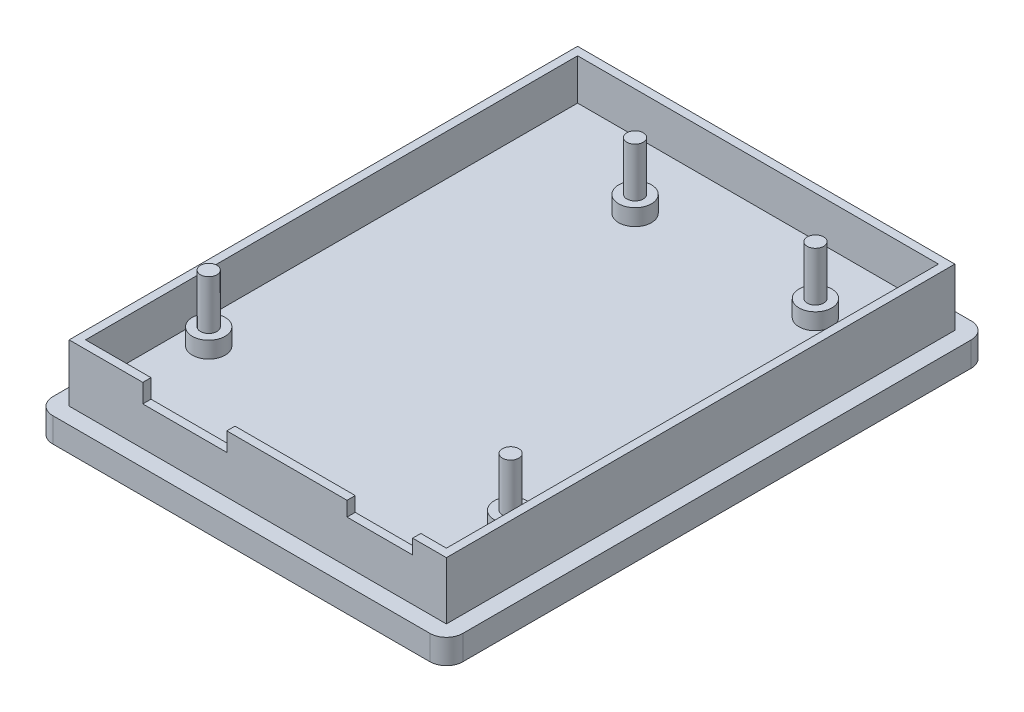
ISO-10303-21;
HEADER;
FILE_DESCRIPTION(('STEP AP214'),'2;1');
FILE_NAME('part.step','',(''),(''),'','','');
FILE_SCHEMA(('AUTOMOTIVE_DESIGN { 1 0 10303 214 1 1 1 1 }'));
ENDSEC;
DATA;
#1=APPLICATION_CONTEXT('core data for automotive mechanical design processes');
#2=APPLICATION_PROTOCOL_DEFINITION('international standard','automotive_design',2000,#1);
#3=PRODUCT_CONTEXT('',#1,'mechanical');
#4=PRODUCT('Part','Part','',(#3));
#5=PRODUCT_RELATED_PRODUCT_CATEGORY('part','',(#4));
#6=PRODUCT_DEFINITION_FORMATION('','',#4);
#7=PRODUCT_DEFINITION_CONTEXT('part definition',#1,'design');
#8=PRODUCT_DEFINITION('design','',#6,#7);
#9=PRODUCT_DEFINITION_SHAPE('','',#8);
#10=(LENGTH_UNIT() NAMED_UNIT(*) SI_UNIT(.MILLI.,.METRE.));
#11=(NAMED_UNIT(*) PLANE_ANGLE_UNIT() SI_UNIT($,.RADIAN.));
#12=(NAMED_UNIT(*) SI_UNIT($,.STERADIAN.) SOLID_ANGLE_UNIT());
#13=UNCERTAINTY_MEASURE_WITH_UNIT(LENGTH_MEASURE(1.E-05),#10,'distance_accuracy_value','');
#14=(GEOMETRIC_REPRESENTATION_CONTEXT(3) GLOBAL_UNCERTAINTY_ASSIGNED_CONTEXT((#13)) GLOBAL_UNIT_ASSIGNED_CONTEXT((#10,
#11,#12)) REPRESENTATION_CONTEXT('',''));
#15=CARTESIAN_POINT('',(0.,0.,0.));
#16=DIRECTION('',(0.,0.,1.));
#17=DIRECTION('',(1.,0.,0.));
#18=AXIS2_PLACEMENT_3D('',#15,#16,#17);
#19=CARTESIAN_POINT('',(0.,12.7,0.));
#20=DIRECTION('',(0.,1.,0.));
#21=DIRECTION('',(0.,0.,1.));
#22=AXIS2_PLACEMENT_3D('',#19,#20,#21);
#23=PLANE('',#22);
#24=DIRECTION('',(0.,0.,-1.));
#25=VECTOR('',#24,1.);
#26=CARTESIAN_POINT('',(23.9812151217302,12.7,0.));
#27=LINE('',#26,#25);
#28=CARTESIAN_POINT('',(23.9812151217302,12.7,39.37));
#29=VERTEX_POINT('',#28);
#30=CARTESIAN_POINT('',(23.9812151217302,12.7,38.1));
#31=VERTEX_POINT('',#30);
#32=EDGE_CURVE('E232',#29,#31,#27,.T.);
#33=ORIENTED_EDGE('',*,*,#32,.F.);
#34=DIRECTION('',(1.,0.,0.));
#35=VECTOR('',#34,1.);
#36=CARTESIAN_POINT('',(29.21,12.7,39.37));
#37=LINE('',#36,#35);
#38=CARTESIAN_POINT('',(29.21,12.7,39.37));
#39=VERTEX_POINT('',#38);
#40=EDGE_CURVE('E296',#29,#39,#37,.T.);
#41=ORIENTED_EDGE('',*,*,#40,.T.);
#42=DIRECTION('',(0.,0.,-1.));
#43=VECTOR('',#42,1.);
#44=CARTESIAN_POINT('',(29.21,12.7,39.37));
#45=LINE('',#44,#43);
#46=CARTESIAN_POINT('',(29.21,12.7,-39.37));
#47=VERTEX_POINT('',#46);
#48=EDGE_CURVE('E314',#39,#47,#45,.T.);
#49=ORIENTED_EDGE('',*,*,#48,.T.);
#50=DIRECTION('',(-1.,0.,0.));
#51=VECTOR('',#50,1.);
#52=CARTESIAN_POINT('',(29.21,12.7,-39.37));
#53=LINE('',#52,#51);
#54=CARTESIAN_POINT('',(-29.21,12.7,-39.37));
#55=VERTEX_POINT('',#54);
#56=EDGE_CURVE('E318',#47,#55,#53,.T.);
#57=ORIENTED_EDGE('',*,*,#56,.T.);
#58=DIRECTION('',(0.,0.,1.));
#59=VECTOR('',#58,1.);
#60=CARTESIAN_POINT('',(-29.21,12.7,39.37));
#61=LINE('',#60,#59);
#62=CARTESIAN_POINT('',(-29.21,12.7,39.37));
#63=VERTEX_POINT('',#62);
#64=EDGE_CURVE('E301',#55,#63,#61,.T.);
#65=ORIENTED_EDGE('',*,*,#64,.T.);
#66=CARTESIAN_POINT('',(-17.8088084611332,12.7,39.37));
#67=VERTEX_POINT('',#66);
#68=EDGE_CURVE('E311',#63,#67,#37,.T.);
#69=ORIENTED_EDGE('',*,*,#68,.T.);
#70=DIRECTION('',(0.,0.,1.));
#71=VECTOR('',#70,1.);
#72=CARTESIAN_POINT('',(-17.8088084611332,12.7,0.));
#73=LINE('',#72,#71);
#74=CARTESIAN_POINT('',(-17.8088084611332,12.7,38.1));
#75=VERTEX_POINT('',#74);
#76=EDGE_CURVE('E254',#75,#67,#73,.T.);
#77=ORIENTED_EDGE('',*,*,#76,.F.);
#78=DIRECTION('',(1.,0.,0.));
#79=VECTOR('',#78,1.);
#80=CARTESIAN_POINT('',(27.94,12.7,38.1));
#81=LINE('',#80,#79);
#82=CARTESIAN_POINT('',(-27.94,12.7,38.1));
#83=VERTEX_POINT('',#82);
#84=EDGE_CURVE('E359',#83,#75,#81,.T.);
#85=ORIENTED_EDGE('',*,*,#84,.F.);
#86=DIRECTION('',(0.,0.,1.));
#87=VECTOR('',#86,1.);
#88=CARTESIAN_POINT('',(-27.94,12.7,38.1));
#89=LINE('',#88,#87);
#90=CARTESIAN_POINT('',(-27.94,12.7,-38.1));
#91=VERTEX_POINT('',#90);
#92=EDGE_CURVE('E342',#91,#83,#89,.T.);
#93=ORIENTED_EDGE('',*,*,#92,.F.);
#94=DIRECTION('',(-1.,0.,0.));
#95=VECTOR('',#94,1.);
#96=CARTESIAN_POINT('',(27.94,12.7,-38.1));
#97=LINE('',#96,#95);
#98=CARTESIAN_POINT('',(27.94,12.7,-38.1));
#99=VERTEX_POINT('',#98);
#100=EDGE_CURVE('E347',#99,#91,#97,.T.);
#101=ORIENTED_EDGE('',*,*,#100,.F.);
#102=DIRECTION('',(0.,0.,-1.));
#103=VECTOR('',#102,1.);
#104=CARTESIAN_POINT('',(27.94,12.7,38.1));
#105=LINE('',#104,#103);
#106=CARTESIAN_POINT('',(27.94,12.7,38.1));
#107=VERTEX_POINT('',#106);
#108=EDGE_CURVE('E362',#107,#99,#105,.T.);
#109=ORIENTED_EDGE('',*,*,#108,.F.);
#110=EDGE_CURVE('E358',#31,#107,#81,.T.);
#111=ORIENTED_EDGE('',*,*,#110,.F.);
#112=EDGE_LOOP('',(#33,#41,#49,#57,#65,#69,#77,#85,#93,#101,#109,#111));
#113=FACE_BOUND('',#112,.T.);
#114=ADVANCED_FACE('F32',(#113),#23,.T.);
#115=CARTESIAN_POINT('',(0.,6.35,0.));
#116=DIRECTION('',(0.,1.,0.));
#117=DIRECTION('',(0.,0.,1.));
#118=AXIS2_PLACEMENT_3D('',#115,#116,#117);
#119=PLANE('',#118);
#120=CARTESIAN_POINT('',(-23.9589209865019,6.35,23.0084652209537));
#121=DIRECTION('',(0.,1.,0.));
#122=DIRECTION('',(0.,0.,1.));
#123=AXIS2_PLACEMENT_3D('',#120,#121,#122);
#124=CIRCLE('',#123,2.54);
#125=CARTESIAN_POINT('',(-23.9589209865019,6.35,25.5484652209538));
#126=VERTEX_POINT('',#125);
#127=EDGE_CURVE('E267',#126,#126,#124,.T.);
#128=ORIENTED_EDGE('',*,*,#127,.F.);
#129=EDGE_LOOP('',(#128));
#130=FACE_BOUND('',#129,.T.);
#131=CARTESIAN_POINT('',(19.208379013498,6.35,-27.7788347790462));
#132=DIRECTION('',(0.,1.,0.));
#133=DIRECTION('',(0.,0.,1.));
#134=AXIS2_PLACEMENT_3D('',#131,#132,#133);
#135=CIRCLE('',#134,2.54);
#136=CARTESIAN_POINT('',(19.208379013498,6.35,-25.2388347790462));
#137=VERTEX_POINT('',#136);
#138=EDGE_CURVE('E281',#137,#137,#135,.T.);
#139=ORIENTED_EDGE('',*,*,#138,.F.);
#140=EDGE_LOOP('',(#139));
#141=FACE_BOUND('',#140,.T.);
#142=DIRECTION('',(0.,0.,1.));
#143=VECTOR('',#142,1.);
#144=CARTESIAN_POINT('',(-27.94,6.35,38.1));
#145=LINE('',#144,#143);
#146=CARTESIAN_POINT('',(-27.94,6.35,-38.1));
#147=VERTEX_POINT('',#146);
#148=CARTESIAN_POINT('',(-27.94,6.35,38.1));
#149=VERTEX_POINT('',#148);
#150=EDGE_CURVE('E343',#147,#149,#145,.T.);
#151=ORIENTED_EDGE('',*,*,#150,.T.);
#152=DIRECTION('',(1.,0.,0.));
#153=VECTOR('',#152,1.);
#154=CARTESIAN_POINT('',(27.94,6.35,38.1));
#155=LINE('',#154,#153);
#156=CARTESIAN_POINT('',(27.94,6.35,38.1));
#157=VERTEX_POINT('',#156);
#158=EDGE_CURVE('E346',#149,#157,#155,.T.);
#159=ORIENTED_EDGE('',*,*,#158,.T.);
#160=DIRECTION('',(0.,0.,-1.));
#161=VECTOR('',#160,1.);
#162=CARTESIAN_POINT('',(27.94,6.35,38.1));
#163=LINE('',#162,#161);
#164=CARTESIAN_POINT('',(27.94,6.35,-38.1));
#165=VERTEX_POINT('',#164);
#166=EDGE_CURVE('E350',#157,#165,#163,.T.);
#167=ORIENTED_EDGE('',*,*,#166,.T.);
#168=DIRECTION('',(-1.,0.,0.));
#169=VECTOR('',#168,1.);
#170=CARTESIAN_POINT('',(27.94,6.35,-38.1));
#171=LINE('',#170,#169);
#172=EDGE_CURVE('E353',#165,#147,#171,.T.);
#173=ORIENTED_EDGE('',*,*,#172,.T.);
#174=EDGE_LOOP('',(#151,#159,#167,#173));
#175=FACE_BOUND('',#174,.T.);
#176=CARTESIAN_POINT('',(-8.71892098650194,6.35,-27.7788347790462));
#177=DIRECTION('',(0.,1.,0.));
#178=DIRECTION('',(0.,0.,1.));
#179=AXIS2_PLACEMENT_3D('',#176,#177,#178);
#180=CIRCLE('',#179,2.54);
#181=CARTESIAN_POINT('',(-8.71892098650194,6.35,-25.2388347790462));
#182=VERTEX_POINT('',#181);
#183=EDGE_CURVE('E274',#182,#182,#180,.T.);
#184=ORIENTED_EDGE('',*,*,#183,.F.);
#185=EDGE_LOOP('',(#184));
#186=FACE_BOUND('',#185,.T.);
#187=CARTESIAN_POINT('',(24.0128707893516,6.35,24.2258112144934));
#188=DIRECTION('',(0.,1.,0.));
#189=DIRECTION('',(0.,0.,1.));
#190=AXIS2_PLACEMENT_3D('',#187,#188,#189);
#191=CIRCLE('',#190,2.54);
#192=CARTESIAN_POINT('',(24.0128707893516,6.35,26.7658112144934));
#193=VERTEX_POINT('',#192);
#194=EDGE_CURVE('E256',#193,#193,#191,.T.);
#195=ORIENTED_EDGE('',*,*,#194,.F.);
#196=EDGE_LOOP('',(#195));
#197=FACE_BOUND('',#196,.T.);
#198=ADVANCED_FACE('F465',(#130,#141,#175,#186,#197),#119,.T.);
#199=DIRECTION('',(0.,0.,1.));
#200=VECTOR('',#199,1.);
#201=CARTESIAN_POINT('',(13.8212151217302,12.7,0.));
#202=LINE('',#201,#200);
#203=CARTESIAN_POINT('',(13.8212151217302,12.7,38.1));
#204=VERTEX_POINT('',#203);
#205=CARTESIAN_POINT('',(13.8212151217302,12.7,39.37));
#206=VERTEX_POINT('',#205);
#207=EDGE_CURVE('E211',#204,#206,#202,.T.);
#208=ORIENTED_EDGE('',*,*,#207,.F.);
#209=CARTESIAN_POINT('',(-4.79841740934006,12.7,38.1));
#210=VERTEX_POINT('',#209);
#211=EDGE_CURVE('E363',#210,#204,#81,.T.);
#212=ORIENTED_EDGE('',*,*,#211,.F.);
#213=DIRECTION('',(0.,0.,-1.));
#214=VECTOR('',#213,1.);
#215=CARTESIAN_POINT('',(-4.79841740934006,12.7,0.));
#216=LINE('',#215,#214);
#217=CARTESIAN_POINT('',(-4.79841740934006,12.7,39.37));
#218=VERTEX_POINT('',#217);
#219=EDGE_CURVE('E249',#218,#210,#216,.T.);
#220=ORIENTED_EDGE('',*,*,#219,.F.);
#221=EDGE_CURVE('E315',#218,#206,#37,.T.);
#222=ORIENTED_EDGE('',*,*,#221,.T.);
#223=EDGE_LOOP('',(#208,#212,#220,#222));
#224=FACE_BOUND('',#223,.T.);
#225=ADVANCED_FACE('F468',(#224),#23,.T.);
#226=CARTESIAN_POINT('',(-27.94,6.35,38.1));
#227=DIRECTION('',(-1.,0.,0.));
#228=DIRECTION('',(0.,0.,1.));
#229=AXIS2_PLACEMENT_3D('',#226,#227,#228);
#230=PLANE('',#229);
#231=ORIENTED_EDGE('',*,*,#92,.T.);
#232=DIRECTION('',(0.,1.,0.));
#233=VECTOR('',#232,1.);
#234=CARTESIAN_POINT('',(-27.94,6.35,38.1));
#235=LINE('',#234,#233);
#236=EDGE_CURVE('E356',#149,#83,#235,.T.);
#237=ORIENTED_EDGE('',*,*,#236,.F.);
#238=ORIENTED_EDGE('',*,*,#150,.F.);
#239=DIRECTION('',(0.,1.,0.));
#240=VECTOR('',#239,1.);
#241=CARTESIAN_POINT('',(-27.94,6.35,-38.1));
#242=LINE('',#241,#240);
#243=EDGE_CURVE('E368',#147,#91,#242,.T.);
#244=ORIENTED_EDGE('',*,*,#243,.T.);
#245=EDGE_LOOP('',(#231,#237,#238,#244));
#246=FACE_BOUND('',#245,.T.);
#247=ADVANCED_FACE('F478',(#246),#230,.F.);
#248=CARTESIAN_POINT('',(27.94,6.35,-38.1));
#249=DIRECTION('',(0.,0.,-1.));
#250=DIRECTION('',(-1.,0.,0.));
#251=AXIS2_PLACEMENT_3D('',#248,#249,#250);
#252=PLANE('',#251);
#253=ORIENTED_EDGE('',*,*,#100,.T.);
#254=ORIENTED_EDGE('',*,*,#243,.F.);
#255=ORIENTED_EDGE('',*,*,#172,.F.);
#256=DIRECTION('',(0.,1.,0.));
#257=VECTOR('',#256,1.);
#258=CARTESIAN_POINT('',(27.94,6.35,-38.1));
#259=LINE('',#258,#257);
#260=EDGE_CURVE('E371',#165,#99,#259,.T.);
#261=ORIENTED_EDGE('',*,*,#260,.T.);
#262=EDGE_LOOP('',(#253,#254,#255,#261));
#263=FACE_BOUND('',#262,.T.);
#264=ADVANCED_FACE('F483',(#263),#252,.F.);
#265=CARTESIAN_POINT('',(27.94,6.35,38.1));
#266=DIRECTION('',(1.,0.,0.));
#267=DIRECTION('',(0.,0.,-1.));
#268=AXIS2_PLACEMENT_3D('',#265,#266,#267);
#269=PLANE('',#268);
#270=ORIENTED_EDGE('',*,*,#108,.T.);
#271=ORIENTED_EDGE('',*,*,#260,.F.);
#272=ORIENTED_EDGE('',*,*,#166,.F.);
#273=DIRECTION('',(0.,1.,0.));
#274=VECTOR('',#273,1.);
#275=CARTESIAN_POINT('',(27.94,6.35,38.1));
#276=LINE('',#275,#274);
#277=EDGE_CURVE('E373',#157,#107,#276,.T.);
#278=ORIENTED_EDGE('',*,*,#277,.T.);
#279=EDGE_LOOP('',(#270,#271,#272,#278));
#280=FACE_BOUND('',#279,.T.);
#281=ADVANCED_FACE('F495',(#280),#269,.F.);
#282=CARTESIAN_POINT('',(27.94,6.35,38.1));
#283=DIRECTION('',(0.,0.,1.));
#284=DIRECTION('',(1.,0.,0.));
#285=AXIS2_PLACEMENT_3D('',#282,#283,#284);
#286=PLANE('',#285);
#287=DIRECTION('',(1.,0.,0.));
#288=VECTOR('',#287,1.);
#289=CARTESIAN_POINT('',(27.94,10.4446167574276,38.1));
#290=LINE('',#289,#288);
#291=CARTESIAN_POINT('',(13.8212151217302,10.4446167574276,38.1));
#292=VERTEX_POINT('',#291);
#293=CARTESIAN_POINT('',(23.9812151217302,10.4446167574276,38.1));
#294=VERTEX_POINT('',#293);
#295=EDGE_CURVE('E202',#292,#294,#290,.T.);
#296=ORIENTED_EDGE('',*,*,#295,.T.);
#297=DIRECTION('',(0.,1.,0.));
#298=VECTOR('',#297,1.);
#299=CARTESIAN_POINT('',(23.9812151217302,6.35,38.1));
#300=LINE('',#299,#298);
#301=EDGE_CURVE('E229',#294,#31,#300,.T.);
#302=ORIENTED_EDGE('',*,*,#301,.T.);
#303=ORIENTED_EDGE('',*,*,#110,.T.);
#304=ORIENTED_EDGE('',*,*,#277,.F.);
#305=ORIENTED_EDGE('',*,*,#158,.F.);
#306=ORIENTED_EDGE('',*,*,#236,.T.);
#307=ORIENTED_EDGE('',*,*,#84,.T.);
#308=DIRECTION('',(0.,-1.,0.));
#309=VECTOR('',#308,1.);
#310=CARTESIAN_POINT('',(-17.8088084611332,6.35,38.1));
#311=LINE('',#310,#309);
#312=CARTESIAN_POINT('',(-17.8088084611332,9.80831502361212,38.1));
#313=VERTEX_POINT('',#312);
#314=EDGE_CURVE('E251',#75,#313,#311,.T.);
#315=ORIENTED_EDGE('',*,*,#314,.T.);
#316=DIRECTION('',(1.,0.,0.));
#317=VECTOR('',#316,1.);
#318=CARTESIAN_POINT('',(27.94,9.80831502361212,38.1));
#319=LINE('',#318,#317);
#320=CARTESIAN_POINT('',(-4.79841740934006,9.80831502361212,38.1));
#321=VERTEX_POINT('',#320);
#322=EDGE_CURVE('E242',#313,#321,#319,.T.);
#323=ORIENTED_EDGE('',*,*,#322,.T.);
#324=DIRECTION('',(0.,1.,0.));
#325=VECTOR('',#324,1.);
#326=CARTESIAN_POINT('',(-4.79841740934006,6.35,38.1));
#327=LINE('',#326,#325);
#328=EDGE_CURVE('E246',#321,#210,#327,.T.);
#329=ORIENTED_EDGE('',*,*,#328,.T.);
#330=ORIENTED_EDGE('',*,*,#211,.T.);
#331=DIRECTION('',(0.,-1.,0.));
#332=VECTOR('',#331,1.);
#333=CARTESIAN_POINT('',(13.8212151217302,6.35,38.1));
#334=LINE('',#333,#332);
#335=EDGE_CURVE('E224',#204,#292,#334,.T.);
#336=ORIENTED_EDGE('',*,*,#335,.T.);
#337=EDGE_LOOP('',(#296,#302,#303,#304,#305,#306,#307,#315,#323,#329,#330,#336));
#338=FACE_BOUND('',#337,.T.);
#339=ADVANCED_FACE('F489',(#338),#286,.F.);
#340=CARTESIAN_POINT('',(0.,3.81,0.));
#341=DIRECTION('',(0.,1.,0.));
#342=DIRECTION('',(0.,0.,1.));
#343=AXIS2_PLACEMENT_3D('',#340,#341,#342);
#344=PLANE('',#343);
#345=DIRECTION('',(0.,0.,1.));
#346=VECTOR('',#345,1.);
#347=CARTESIAN_POINT('',(-29.21,3.81,39.37));
#348=LINE('',#347,#346);
#349=CARTESIAN_POINT('',(-29.21,3.81,-39.37));
#350=VERTEX_POINT('',#349);
#351=CARTESIAN_POINT('',(-29.21,3.81,39.37));
#352=VERTEX_POINT('',#351);
#353=EDGE_CURVE('E307',#350,#352,#348,.T.);
#354=ORIENTED_EDGE('',*,*,#353,.F.);
#355=DIRECTION('',(-1.,0.,0.));
#356=VECTOR('',#355,1.);
#357=CARTESIAN_POINT('',(29.21,3.81,-39.37));
#358=LINE('',#357,#356);
#359=CARTESIAN_POINT('',(29.21,3.81,-39.37));
#360=VERTEX_POINT('',#359);
#361=EDGE_CURVE('E304',#360,#350,#358,.T.);
#362=ORIENTED_EDGE('',*,*,#361,.F.);
#363=DIRECTION('',(0.,0.,-1.));
#364=VECTOR('',#363,1.);
#365=CARTESIAN_POINT('',(29.21,3.81,39.37));
#366=LINE('',#365,#364);
#367=CARTESIAN_POINT('',(29.21,3.81,39.37));
#368=VERTEX_POINT('',#367);
#369=EDGE_CURVE('E300',#368,#360,#366,.T.);
#370=ORIENTED_EDGE('',*,*,#369,.F.);
#371=DIRECTION('',(1.,0.,0.));
#372=VECTOR('',#371,1.);
#373=CARTESIAN_POINT('',(29.21,3.81,39.37));
#374=LINE('',#373,#372);
#375=EDGE_CURVE('E297',#352,#368,#374,.T.);
#376=ORIENTED_EDGE('',*,*,#375,.F.);
#377=EDGE_LOOP('',(#354,#362,#370,#376));
#378=FACE_BOUND('',#377,.T.);
#379=DIRECTION('',(-1.,0.,0.));
#380=VECTOR('',#379,1.);
#381=CARTESIAN_POINT('',(31.75,3.81,-41.91));
#382=LINE('',#381,#380);
#383=CARTESIAN_POINT('',(29.21,3.81,-41.91));
#384=VERTEX_POINT('',#383);
#385=CARTESIAN_POINT('',(-29.21,3.81,-41.91));
#386=VERTEX_POINT('',#385);
#387=EDGE_CURVE('E335',#384,#386,#382,.T.);
#388=ORIENTED_EDGE('',*,*,#387,.T.);
#389=CARTESIAN_POINT('',(-29.21,3.81,-39.37));
#390=DIRECTION('',(0.,1.,0.));
#391=DIRECTION('',(0.,0.,1.));
#392=AXIS2_PLACEMENT_3D('',#389,#390,#391);
#393=CIRCLE('',#392,2.54);
#394=CARTESIAN_POINT('',(-31.75,3.81,-39.37));
#395=VERTEX_POINT('',#394);
#396=EDGE_CURVE('E420',#386,#395,#393,.T.);
#397=ORIENTED_EDGE('',*,*,#396,.T.);
#398=DIRECTION('',(0.,0.,1.));
#399=VECTOR('',#398,1.);
#400=CARTESIAN_POINT('',(-31.75,3.81,41.91));
#401=LINE('',#400,#399);
#402=CARTESIAN_POINT('',(-31.75,3.81,39.37));
#403=VERTEX_POINT('',#402);
#404=EDGE_CURVE('E338',#395,#403,#401,.T.);
#405=ORIENTED_EDGE('',*,*,#404,.T.);
#406=CARTESIAN_POINT('',(-29.21,3.81,39.37));
#407=DIRECTION('',(0.,1.,0.));
#408=DIRECTION('',(0.,0.,1.));
#409=AXIS2_PLACEMENT_3D('',#406,#407,#408);
#410=CIRCLE('',#409,2.54);
#411=CARTESIAN_POINT('',(-29.21,3.81,41.91));
#412=VERTEX_POINT('',#411);
#413=EDGE_CURVE('E53',#403,#412,#410,.T.);
#414=ORIENTED_EDGE('',*,*,#413,.T.);
#415=DIRECTION('',(1.,0.,0.));
#416=VECTOR('',#415,1.);
#417=CARTESIAN_POINT('',(31.75,3.81,41.91));
#418=LINE('',#417,#416);
#419=CARTESIAN_POINT('',(29.21,3.81,41.91));
#420=VERTEX_POINT('',#419);
#421=EDGE_CURVE('E340',#412,#420,#418,.T.);
#422=ORIENTED_EDGE('',*,*,#421,.T.);
#423=CARTESIAN_POINT('',(29.21,3.81,39.37));
#424=DIRECTION('',(0.,1.,0.));
#425=DIRECTION('',(0.,0.,1.));
#426=AXIS2_PLACEMENT_3D('',#423,#424,#425);
#427=CIRCLE('',#426,2.54);
#428=CARTESIAN_POINT('',(31.75,3.81,39.37));
#429=VERTEX_POINT('',#428);
#430=EDGE_CURVE('E415',#420,#429,#427,.T.);
#431=ORIENTED_EDGE('',*,*,#430,.T.);
#432=DIRECTION('',(0.,0.,-1.));
#433=VECTOR('',#432,1.);
#434=CARTESIAN_POINT('',(31.75,3.81,41.91));
#435=LINE('',#434,#433);
#436=CARTESIAN_POINT('',(31.75,3.81,-39.37));
#437=VERTEX_POINT('',#436);
#438=EDGE_CURVE('E325',#429,#437,#435,.T.);
#439=ORIENTED_EDGE('',*,*,#438,.T.);
#440=CARTESIAN_POINT('',(29.21,3.81,-39.37));
#441=DIRECTION('',(0.,1.,0.));
#442=DIRECTION('',(0.,0.,1.));
#443=AXIS2_PLACEMENT_3D('',#440,#441,#442);
#444=CIRCLE('',#443,2.54);
#445=EDGE_CURVE('E418',#437,#384,#444,.T.);
#446=ORIENTED_EDGE('',*,*,#445,.T.);
#447=EDGE_LOOP('',(#388,#397,#405,#414,#422,#431,#439,#446));
#448=FACE_BOUND('',#447,.T.);
#449=ADVANCED_FACE('F434',(#378,#448),#344,.T.);
#450=CARTESIAN_POINT('',(29.21,3.81,39.37));
#451=DIRECTION('',(0.,0.,1.));
#452=DIRECTION('',(1.,0.,0.));
#453=AXIS2_PLACEMENT_3D('',#450,#451,#452);
#454=PLANE('',#453);
#455=DIRECTION('',(0.,1.,0.));
#456=VECTOR('',#455,1.);
#457=CARTESIAN_POINT('',(23.9812151217302,10.4446167574276,39.37));
#458=LINE('',#457,#456);
#459=CARTESIAN_POINT('',(23.9812151217302,10.4446167574276,39.37));
#460=VERTEX_POINT('',#459);
#461=EDGE_CURVE('E220',#460,#29,#458,.T.);
#462=ORIENTED_EDGE('',*,*,#461,.F.);
#463=DIRECTION('',(1.,0.,0.));
#464=VECTOR('',#463,1.);
#465=CARTESIAN_POINT('',(23.9812151217302,10.4446167574276,39.37));
#466=LINE('',#465,#464);
#467=CARTESIAN_POINT('',(13.8212151217302,10.4446167574276,39.37));
#468=VERTEX_POINT('',#467);
#469=EDGE_CURVE('E199',#468,#460,#466,.T.);
#470=ORIENTED_EDGE('',*,*,#469,.F.);
#471=DIRECTION('',(0.,-1.,0.));
#472=VECTOR('',#471,1.);
#473=CARTESIAN_POINT('',(13.8212151217302,3.81,39.37));
#474=LINE('',#473,#472);
#475=EDGE_CURVE('E208',#206,#468,#474,.T.);
#476=ORIENTED_EDGE('',*,*,#475,.F.);
#477=ORIENTED_EDGE('',*,*,#221,.F.);
#478=DIRECTION('',(0.,1.,0.));
#479=VECTOR('',#478,1.);
#480=CARTESIAN_POINT('',(-4.79841740934006,9.80831502361212,39.37));
#481=LINE('',#480,#479);
#482=CARTESIAN_POINT('',(-4.79841740934006,9.80831502361212,39.37));
#483=VERTEX_POINT('',#482);
#484=EDGE_CURVE('E237',#483,#218,#481,.T.);
#485=ORIENTED_EDGE('',*,*,#484,.F.);
#486=DIRECTION('',(1.,0.,0.));
#487=VECTOR('',#486,1.);
#488=CARTESIAN_POINT('',(-17.8088084611332,9.80831502361212,39.37));
#489=LINE('',#488,#487);
#490=CARTESIAN_POINT('',(-17.8088084611332,9.80831502361212,39.37));
#491=VERTEX_POINT('',#490);
#492=EDGE_CURVE('E234',#491,#483,#489,.T.);
#493=ORIENTED_EDGE('',*,*,#492,.F.);
#494=DIRECTION('',(0.,-1.,0.));
#495=VECTOR('',#494,1.);
#496=CARTESIAN_POINT('',(-17.8088084611332,3.81,39.37));
#497=LINE('',#496,#495);
#498=EDGE_CURVE('E216',#67,#491,#497,.T.);
#499=ORIENTED_EDGE('',*,*,#498,.F.);
#500=ORIENTED_EDGE('',*,*,#68,.F.);
#501=DIRECTION('',(0.,1.,0.));
#502=VECTOR('',#501,1.);
#503=CARTESIAN_POINT('',(-29.21,3.81,39.37));
#504=LINE('',#503,#502);
#505=EDGE_CURVE('E323',#352,#63,#504,.T.);
#506=ORIENTED_EDGE('',*,*,#505,.F.);
#507=ORIENTED_EDGE('',*,*,#375,.T.);
#508=DIRECTION('',(0.,1.,0.));
#509=VECTOR('',#508,1.);
#510=CARTESIAN_POINT('',(29.21,3.81,39.37));
#511=LINE('',#510,#509);
#512=EDGE_CURVE('E310',#368,#39,#511,.T.);
#513=ORIENTED_EDGE('',*,*,#512,.T.);
#514=ORIENTED_EDGE('',*,*,#40,.F.);
#515=EDGE_LOOP('',(#462,#470,#476,#477,#485,#493,#499,#500,#506,#507,#513,#514));
#516=FACE_BOUND('',#515,.T.);
#517=ADVANCED_FACE('F218',(#516),#454,.T.);
#518=CARTESIAN_POINT('',(-29.21,3.81,39.37));
#519=DIRECTION('',(-1.,0.,0.));
#520=DIRECTION('',(0.,0.,1.));
#521=AXIS2_PLACEMENT_3D('',#518,#519,#520);
#522=PLANE('',#521);
#523=ORIENTED_EDGE('',*,*,#64,.F.);
#524=DIRECTION('',(0.,1.,0.));
#525=VECTOR('',#524,1.);
#526=CARTESIAN_POINT('',(-29.21,3.81,-39.37));
#527=LINE('',#526,#525);
#528=EDGE_CURVE('E326',#350,#55,#527,.T.);
#529=ORIENTED_EDGE('',*,*,#528,.F.);
#530=ORIENTED_EDGE('',*,*,#353,.T.);
#531=ORIENTED_EDGE('',*,*,#505,.T.);
#532=EDGE_LOOP('',(#523,#529,#530,#531));
#533=FACE_BOUND('',#532,.T.);
#534=ADVANCED_FACE('F527',(#533),#522,.T.);
#535=CARTESIAN_POINT('',(29.21,3.81,-39.37));
#536=DIRECTION('',(0.,0.,-1.));
#537=DIRECTION('',(-1.,0.,0.));
#538=AXIS2_PLACEMENT_3D('',#535,#536,#537);
#539=PLANE('',#538);
#540=ORIENTED_EDGE('',*,*,#56,.F.);
#541=DIRECTION('',(0.,1.,0.));
#542=VECTOR('',#541,1.);
#543=CARTESIAN_POINT('',(29.21,3.81,-39.37));
#544=LINE('',#543,#542);
#545=EDGE_CURVE('E328',#360,#47,#544,.T.);
#546=ORIENTED_EDGE('',*,*,#545,.F.);
#547=ORIENTED_EDGE('',*,*,#361,.T.);
#548=ORIENTED_EDGE('',*,*,#528,.T.);
#549=EDGE_LOOP('',(#540,#546,#547,#548));
#550=FACE_BOUND('',#549,.T.);
#551=ADVANCED_FACE('F524',(#550),#539,.T.);
#552=CARTESIAN_POINT('',(29.21,3.81,39.37));
#553=DIRECTION('',(1.,0.,0.));
#554=DIRECTION('',(0.,0.,-1.));
#555=AXIS2_PLACEMENT_3D('',#552,#553,#554);
#556=PLANE('',#555);
#557=ORIENTED_EDGE('',*,*,#48,.F.);
#558=ORIENTED_EDGE('',*,*,#512,.F.);
#559=ORIENTED_EDGE('',*,*,#369,.T.);
#560=ORIENTED_EDGE('',*,*,#545,.T.);
#561=EDGE_LOOP('',(#557,#558,#559,#560));
#562=FACE_BOUND('',#561,.T.);
#563=ADVANCED_FACE('F521',(#562),#556,.T.);
#564=CARTESIAN_POINT('',(0.,0.,0.));
#565=DIRECTION('',(0.,1.,0.));
#566=DIRECTION('',(0.,0.,1.));
#567=AXIS2_PLACEMENT_3D('',#564,#565,#566);
#568=PLANE('',#567);
#569=DIRECTION('',(0.,0.,1.));
#570=VECTOR('',#569,1.);
#571=CARTESIAN_POINT('',(-31.75,0.,-41.91));
#572=LINE('',#571,#570);
#573=CARTESIAN_POINT('',(-31.75,0.,-39.37));
#574=VERTEX_POINT('',#573);
#575=CARTESIAN_POINT('',(-31.75,0.,39.37));
#576=VERTEX_POINT('',#575);
#577=EDGE_CURVE('E383',#574,#576,#572,.T.);
#578=ORIENTED_EDGE('',*,*,#577,.F.);
#579=CARTESIAN_POINT('',(-29.21,0.,-39.37));
#580=DIRECTION('',(0.,1.,0.));
#581=DIRECTION('',(0.,0.,1.));
#582=AXIS2_PLACEMENT_3D('',#579,#580,#581);
#583=CIRCLE('',#582,2.54);
#584=CARTESIAN_POINT('',(-29.21,0.,-41.91));
#585=VERTEX_POINT('',#584);
#586=EDGE_CURVE('E408',#574,#585,#583,.F.);
#587=ORIENTED_EDGE('',*,*,#586,.T.);
#588=DIRECTION('',(-1.,0.,0.));
#589=VECTOR('',#588,1.);
#590=CARTESIAN_POINT('',(-31.75,0.,-41.91));
#591=LINE('',#590,#589);
#592=CARTESIAN_POINT('',(29.21,0.,-41.91));
#593=VERTEX_POINT('',#592);
#594=EDGE_CURVE('E380',#593,#585,#591,.T.);
#595=ORIENTED_EDGE('',*,*,#594,.F.);
#596=CARTESIAN_POINT('',(29.21,0.,-39.37));
#597=DIRECTION('',(0.,1.,0.));
#598=DIRECTION('',(0.,0.,1.));
#599=AXIS2_PLACEMENT_3D('',#596,#597,#598);
#600=CIRCLE('',#599,2.54);
#601=CARTESIAN_POINT('',(31.75,0.,-39.37));
#602=VERTEX_POINT('',#601);
#603=EDGE_CURVE('E406',#593,#602,#600,.F.);
#604=ORIENTED_EDGE('',*,*,#603,.T.);
#605=DIRECTION('',(0.,0.,-1.));
#606=VECTOR('',#605,1.);
#607=CARTESIAN_POINT('',(31.75,0.,-41.91));
#608=LINE('',#607,#606);
#609=CARTESIAN_POINT('',(31.75,0.,39.37));
#610=VERTEX_POINT('',#609);
#611=EDGE_CURVE('E370',#610,#602,#608,.T.);
#612=ORIENTED_EDGE('',*,*,#611,.F.);
#613=CARTESIAN_POINT('',(29.21,0.,39.37));
#614=DIRECTION('',(0.,1.,0.));
#615=DIRECTION('',(0.,0.,1.));
#616=AXIS2_PLACEMENT_3D('',#613,#614,#615);
#617=CIRCLE('',#616,2.54);
#618=CARTESIAN_POINT('',(29.21,0.,41.91));
#619=VERTEX_POINT('',#618);
#620=EDGE_CURVE('E402',#610,#619,#617,.F.);
#621=ORIENTED_EDGE('',*,*,#620,.T.);
#622=DIRECTION('',(1.,0.,0.));
#623=VECTOR('',#622,1.);
#624=CARTESIAN_POINT('',(-31.75,0.,41.91));
#625=LINE('',#624,#623);
#626=CARTESIAN_POINT('',(-29.21,0.,41.91));
#627=VERTEX_POINT('',#626);
#628=EDGE_CURVE('E386',#627,#619,#625,.T.);
#629=ORIENTED_EDGE('',*,*,#628,.F.);
#630=CARTESIAN_POINT('',(-29.21,0.,39.37));
#631=DIRECTION('',(0.,1.,0.));
#632=DIRECTION('',(0.,0.,1.));
#633=AXIS2_PLACEMENT_3D('',#630,#631,#632);
#634=CIRCLE('',#633,2.54);
#635=EDGE_CURVE('E404',#627,#576,#634,.F.);
#636=ORIENTED_EDGE('',*,*,#635,.T.);
#637=EDGE_LOOP('',(#578,#587,#595,#604,#612,#621,#629,#636));
#638=FACE_BOUND('',#637,.T.);
#639=ADVANCED_FACE('F445',(#638),#568,.F.);
#640=CARTESIAN_POINT('',(-31.75,12.7,41.91));
#641=DIRECTION('',(0.,0.,-1.));
#642=DIRECTION('',(-1.,0.,0.));
#643=AXIS2_PLACEMENT_3D('',#640,#641,#642);
#644=PLANE('',#643);
#645=ORIENTED_EDGE('',*,*,#421,.F.);
#646=DIRECTION('',(0.,-1.,0.));
#647=VECTOR('',#646,1.);
#648=CARTESIAN_POINT('',(-29.21,12.7,41.91));
#649=LINE('',#648,#647);
#650=EDGE_CURVE('E11',#412,#627,#649,.T.);
#651=ORIENTED_EDGE('',*,*,#650,.T.);
#652=ORIENTED_EDGE('',*,*,#628,.T.);
#653=DIRECTION('',(0.,-1.,0.));
#654=VECTOR('',#653,1.);
#655=CARTESIAN_POINT('',(29.21,12.7,41.91));
#656=LINE('',#655,#654);
#657=EDGE_CURVE('E40',#619,#420,#656,.F.);
#658=ORIENTED_EDGE('',*,*,#657,.T.);
#659=EDGE_LOOP('',(#645,#651,#652,#658));
#660=FACE_BOUND('',#659,.T.);
#661=ADVANCED_FACE('F458',(#660),#644,.F.);
#662=CARTESIAN_POINT('',(-31.75,12.7,-41.91));
#663=DIRECTION('',(1.,0.,0.));
#664=DIRECTION('',(0.,0.,-1.));
#665=AXIS2_PLACEMENT_3D('',#662,#663,#664);
#666=PLANE('',#665);
#667=ORIENTED_EDGE('',*,*,#404,.F.);
#668=DIRECTION('',(0.,-1.,0.));
#669=VECTOR('',#668,1.);
#670=CARTESIAN_POINT('',(-31.75,12.7,-39.37));
#671=LINE('',#670,#669);
#672=EDGE_CURVE('E399',#395,#574,#671,.T.);
#673=ORIENTED_EDGE('',*,*,#672,.T.);
#674=ORIENTED_EDGE('',*,*,#577,.T.);
#675=DIRECTION('',(0.,-1.,0.));
#676=VECTOR('',#675,1.);
#677=CARTESIAN_POINT('',(-31.75,12.7,39.37));
#678=LINE('',#677,#676);
#679=EDGE_CURVE('E215',#576,#403,#678,.F.);
#680=ORIENTED_EDGE('',*,*,#679,.T.);
#681=EDGE_LOOP('',(#667,#673,#674,#680));
#682=FACE_BOUND('',#681,.T.);
#683=ADVANCED_FACE('F452',(#682),#666,.F.);
#684=CARTESIAN_POINT('',(-31.75,12.7,-41.91));
#685=DIRECTION('',(0.,0.,1.));
#686=DIRECTION('',(1.,0.,0.));
#687=AXIS2_PLACEMENT_3D('',#684,#685,#686);
#688=PLANE('',#687);
#689=ORIENTED_EDGE('',*,*,#594,.T.);
#690=DIRECTION('',(0.,-1.,0.));
#691=VECTOR('',#690,1.);
#692=CARTESIAN_POINT('',(-29.21,12.7,-41.91));
#693=LINE('',#692,#691);
#694=EDGE_CURVE('E413',#585,#386,#693,.F.);
#695=ORIENTED_EDGE('',*,*,#694,.T.);
#696=ORIENTED_EDGE('',*,*,#387,.F.);
#697=DIRECTION('',(0.,-1.,0.));
#698=VECTOR('',#697,1.);
#699=CARTESIAN_POINT('',(29.21,12.7,-41.91));
#700=LINE('',#699,#698);
#701=EDGE_CURVE('E410',#384,#593,#700,.T.);
#702=ORIENTED_EDGE('',*,*,#701,.T.);
#703=EDGE_LOOP('',(#689,#695,#696,#702));
#704=FACE_BOUND('',#703,.T.);
#705=ADVANCED_FACE('F441',(#704),#688,.F.);
#706=CARTESIAN_POINT('',(31.75,12.7,-41.91));
#707=DIRECTION('',(-1.,0.,0.));
#708=DIRECTION('',(0.,0.,1.));
#709=AXIS2_PLACEMENT_3D('',#706,#707,#708);
#710=PLANE('',#709);
#711=ORIENTED_EDGE('',*,*,#611,.T.);
#712=DIRECTION('',(0.,-1.,0.));
#713=VECTOR('',#712,1.);
#714=CARTESIAN_POINT('',(31.75,12.7,-39.37));
#715=LINE('',#714,#713);
#716=EDGE_CURVE('E425',#602,#437,#715,.F.);
#717=ORIENTED_EDGE('',*,*,#716,.T.);
#718=ORIENTED_EDGE('',*,*,#438,.F.);
#719=DIRECTION('',(0.,-1.,0.));
#720=VECTOR('',#719,1.);
#721=CARTESIAN_POINT('',(31.75,12.7,39.37));
#722=LINE('',#721,#720);
#723=EDGE_CURVE('E422',#429,#610,#722,.T.);
#724=ORIENTED_EDGE('',*,*,#723,.T.);
#725=EDGE_LOOP('',(#711,#717,#718,#724));
#726=FACE_BOUND('',#725,.T.);
#727=ADVANCED_FACE('F429',(#726),#710,.F.);
#728=CARTESIAN_POINT('',(19.208379013498,8.89,-27.7788347790462));
#729=DIRECTION('',(0.,1.,0.));
#730=DIRECTION('',(0.,0.,1.));
#731=AXIS2_PLACEMENT_3D('',#728,#729,#730);
#732=PLANE('',#731);
#733=CARTESIAN_POINT('',(19.208379013498,8.89,-27.7788347790462));
#734=DIRECTION('',(0.,1.,0.));
#735=DIRECTION('',(0.,0.,1.));
#736=AXIS2_PLACEMENT_3D('',#733,#734,#735);
#737=CIRCLE('',#736,2.54);
#738=CARTESIAN_POINT('',(19.208379013498,8.89,-25.2388347790462));
#739=VERTEX_POINT('',#738);
#740=EDGE_CURVE('E277',#739,#739,#737,.T.);
#741=ORIENTED_EDGE('',*,*,#740,.T.);
#742=EDGE_LOOP('',(#741));
#743=FACE_BOUND('',#742,.T.);
#744=CARTESIAN_POINT('',(19.208379013498,8.89,-27.7788347790462));
#745=DIRECTION('',(0.,1.,0.));
#746=DIRECTION('',(0.,0.,1.));
#747=AXIS2_PLACEMENT_3D('',#744,#745,#746);
#748=CIRCLE('',#747,1.27);
#749=CARTESIAN_POINT('',(19.208379013498,8.89,-26.5088347790462));
#750=VERTEX_POINT('',#749);
#751=EDGE_CURVE('E280',#750,#750,#748,.T.);
#752=ORIENTED_EDGE('',*,*,#751,.F.);
#753=EDGE_LOOP('',(#752));
#754=FACE_BOUND('',#753,.T.);
#755=ADVANCED_FACE('F619',(#743,#754),#732,.T.);
#756=CARTESIAN_POINT('',(19.208379013498,8.89,-27.7788347790462));
#757=DIRECTION('',(0.,-1.,0.));
#758=DIRECTION('',(0.,0.,-1.));
#759=AXIS2_PLACEMENT_3D('',#756,#757,#758);
#760=CYLINDRICAL_SURFACE('',#759,2.54);
#761=ORIENTED_EDGE('',*,*,#740,.F.);
#762=EDGE_LOOP('',(#761));
#763=FACE_BOUND('',#762,.T.);
#764=ORIENTED_EDGE('',*,*,#138,.T.);
#765=EDGE_LOOP('',(#764));
#766=FACE_BOUND('',#765,.T.);
#767=ADVANCED_FACE('F628',(#763,#766),#760,.T.);
#768=CARTESIAN_POINT('',(19.208379013498,16.51,-27.7788347790462));
#769=DIRECTION('',(0.,1.,0.));
#770=DIRECTION('',(0.,0.,1.));
#771=AXIS2_PLACEMENT_3D('',#768,#769,#770);
#772=PLANE('',#771);
#773=CARTESIAN_POINT('',(19.208379013498,16.51,-27.7788347790462));
#774=DIRECTION('',(0.,1.,0.));
#775=DIRECTION('',(0.,0.,1.));
#776=AXIS2_PLACEMENT_3D('',#773,#774,#775);
#777=CIRCLE('',#776,1.27);
#778=CARTESIAN_POINT('',(19.208379013498,16.51,-26.5088347790462));
#779=VERTEX_POINT('',#778);
#780=EDGE_CURVE('E287',#779,#779,#777,.T.);
#781=ORIENTED_EDGE('',*,*,#780,.T.);
#782=EDGE_LOOP('',(#781));
#783=FACE_BOUND('',#782,.T.);
#784=ADVANCED_FACE('F637',(#783),#772,.T.);
#785=CARTESIAN_POINT('',(19.208379013498,16.51,-27.7788347790462));
#786=DIRECTION('',(0.,-1.,0.));
#787=DIRECTION('',(0.,0.,-1.));
#788=AXIS2_PLACEMENT_3D('',#785,#786,#787);
#789=CYLINDRICAL_SURFACE('',#788,1.27);
#790=ORIENTED_EDGE('',*,*,#751,.T.);
#791=EDGE_LOOP('',(#790));
#792=FACE_BOUND('',#791,.T.);
#793=ORIENTED_EDGE('',*,*,#780,.F.);
#794=EDGE_LOOP('',(#793));
#795=FACE_BOUND('',#794,.T.);
#796=ADVANCED_FACE('F646',(#792,#795),#789,.T.);
#797=CARTESIAN_POINT('',(-8.71892098650194,8.89,-27.7788347790462));
#798=DIRECTION('',(0.,1.,0.));
#799=DIRECTION('',(0.,0.,1.));
#800=AXIS2_PLACEMENT_3D('',#797,#798,#799);
#801=PLANE('',#800);
#802=CARTESIAN_POINT('',(-8.71892098650194,8.89,-27.7788347790462));
#803=DIRECTION('',(0.,1.,0.));
#804=DIRECTION('',(0.,0.,1.));
#805=AXIS2_PLACEMENT_3D('',#802,#803,#804);
#806=CIRCLE('',#805,2.54);
#807=CARTESIAN_POINT('',(-8.71892098650194,8.89,-25.2388347790462));
#808=VERTEX_POINT('',#807);
#809=EDGE_CURVE('E270',#808,#808,#806,.T.);
#810=ORIENTED_EDGE('',*,*,#809,.T.);
#811=EDGE_LOOP('',(#810));
#812=FACE_BOUND('',#811,.T.);
#813=CARTESIAN_POINT('',(-8.71892098650194,8.89,-27.7788347790462));
#814=DIRECTION('',(0.,1.,0.));
#815=DIRECTION('',(0.,0.,1.));
#816=AXIS2_PLACEMENT_3D('',#813,#814,#815);
#817=CIRCLE('',#816,1.27);
#818=CARTESIAN_POINT('',(-8.71892098650194,8.89,-26.5088347790462));
#819=VERTEX_POINT('',#818);
#820=EDGE_CURVE('E273',#819,#819,#817,.T.);
#821=ORIENTED_EDGE('',*,*,#820,.F.);
#822=EDGE_LOOP('',(#821));
#823=FACE_BOUND('',#822,.T.);
#824=ADVANCED_FACE('F655',(#812,#823),#801,.T.);
#825=CARTESIAN_POINT('',(-8.71892098650194,8.89,-27.7788347790462));
#826=DIRECTION('',(0.,-1.,0.));
#827=DIRECTION('',(0.,0.,-1.));
#828=AXIS2_PLACEMENT_3D('',#825,#826,#827);
#829=CYLINDRICAL_SURFACE('',#828,2.54);
#830=ORIENTED_EDGE('',*,*,#809,.F.);
#831=EDGE_LOOP('',(#830));
#832=FACE_BOUND('',#831,.T.);
#833=ORIENTED_EDGE('',*,*,#183,.T.);
#834=EDGE_LOOP('',(#833));
#835=FACE_BOUND('',#834,.T.);
#836=ADVANCED_FACE('F663',(#832,#835),#829,.T.);
#837=CARTESIAN_POINT('',(-8.71892098650194,16.51,-27.7788347790462));
#838=DIRECTION('',(0.,1.,0.));
#839=DIRECTION('',(0.,0.,1.));
#840=AXIS2_PLACEMENT_3D('',#837,#838,#839);
#841=PLANE('',#840);
#842=CARTESIAN_POINT('',(-8.71892098650194,16.51,-27.7788347790462));
#843=DIRECTION('',(0.,1.,0.));
#844=DIRECTION('',(0.,0.,1.));
#845=AXIS2_PLACEMENT_3D('',#842,#843,#844);
#846=CIRCLE('',#845,1.27);
#847=CARTESIAN_POINT('',(-8.71892098650194,16.51,-26.5088347790462));
#848=VERTEX_POINT('',#847);
#849=EDGE_CURVE('E290',#848,#848,#846,.T.);
#850=ORIENTED_EDGE('',*,*,#849,.T.);
#851=EDGE_LOOP('',(#850));
#852=FACE_BOUND('',#851,.T.);
#853=ADVANCED_FACE('F671',(#852),#841,.T.);
#854=CARTESIAN_POINT('',(-8.71892098650194,16.51,-27.7788347790462));
#855=DIRECTION('',(0.,-1.,0.));
#856=DIRECTION('',(0.,0.,-1.));
#857=AXIS2_PLACEMENT_3D('',#854,#855,#856);
#858=CYLINDRICAL_SURFACE('',#857,1.27);
#859=ORIENTED_EDGE('',*,*,#820,.T.);
#860=EDGE_LOOP('',(#859));
#861=FACE_BOUND('',#860,.T.);
#862=ORIENTED_EDGE('',*,*,#849,.F.);
#863=EDGE_LOOP('',(#862));
#864=FACE_BOUND('',#863,.T.);
#865=ADVANCED_FACE('F679',(#861,#864),#858,.T.);
#866=CARTESIAN_POINT('',(-23.9589209865019,8.89,23.0084652209537));
#867=DIRECTION('',(0.,1.,0.));
#868=DIRECTION('',(0.,0.,1.));
#869=AXIS2_PLACEMENT_3D('',#866,#867,#868);
#870=PLANE('',#869);
#871=CARTESIAN_POINT('',(-23.9589209865019,8.89,23.0084652209537));
#872=DIRECTION('',(0.,1.,0.));
#873=DIRECTION('',(0.,0.,1.));
#874=AXIS2_PLACEMENT_3D('',#871,#872,#873);
#875=CIRCLE('',#874,2.54);
#876=CARTESIAN_POINT('',(-23.9589209865019,8.89,25.5484652209538));
#877=VERTEX_POINT('',#876);
#878=EDGE_CURVE('E263',#877,#877,#875,.T.);
#879=ORIENTED_EDGE('',*,*,#878,.T.);
#880=EDGE_LOOP('',(#879));
#881=FACE_BOUND('',#880,.T.);
#882=CARTESIAN_POINT('',(-23.9589209865019,8.89,23.0084652209537));
#883=DIRECTION('',(0.,1.,0.));
#884=DIRECTION('',(0.,0.,1.));
#885=AXIS2_PLACEMENT_3D('',#882,#883,#884);
#886=CIRCLE('',#885,1.26999999999999);
#887=CARTESIAN_POINT('',(-23.9589209865019,8.89,24.2784652209537));
#888=VERTEX_POINT('',#887);
#889=EDGE_CURVE('E266',#888,#888,#886,.T.);
#890=ORIENTED_EDGE('',*,*,#889,.F.);
#891=EDGE_LOOP('',(#890));
#892=FACE_BOUND('',#891,.T.);
#893=ADVANCED_FACE('F686',(#881,#892),#870,.T.);
#894=CARTESIAN_POINT('',(-23.9589209865019,8.89,23.0084652209537));
#895=DIRECTION('',(0.,-1.,0.));
#896=DIRECTION('',(0.,0.,-1.));
#897=AXIS2_PLACEMENT_3D('',#894,#895,#896);
#898=CYLINDRICAL_SURFACE('',#897,2.54);
#899=ORIENTED_EDGE('',*,*,#878,.F.);
#900=EDGE_LOOP('',(#899));
#901=FACE_BOUND('',#900,.T.);
#902=ORIENTED_EDGE('',*,*,#127,.T.);
#903=EDGE_LOOP('',(#902));
#904=FACE_BOUND('',#903,.T.);
#905=ADVANCED_FACE('F694',(#901,#904),#898,.T.);
#906=CARTESIAN_POINT('',(-23.9589209865019,16.51,23.0084652209537));
#907=DIRECTION('',(0.,1.,0.));
#908=DIRECTION('',(0.,0.,1.));
#909=AXIS2_PLACEMENT_3D('',#906,#907,#908);
#910=PLANE('',#909);
#911=CARTESIAN_POINT('',(-23.9589209865019,16.51,23.0084652209537));
#912=DIRECTION('',(0.,1.,0.));
#913=DIRECTION('',(0.,0.,1.));
#914=AXIS2_PLACEMENT_3D('',#911,#912,#913);
#915=CIRCLE('',#914,1.26999999999999);
#916=CARTESIAN_POINT('',(-23.9589209865019,16.51,24.2784652209537));
#917=VERTEX_POINT('',#916);
#918=EDGE_CURVE('E293',#917,#917,#915,.T.);
#919=ORIENTED_EDGE('',*,*,#918,.T.);
#920=EDGE_LOOP('',(#919));
#921=FACE_BOUND('',#920,.T.);
#922=ADVANCED_FACE('F702',(#921),#910,.T.);
#923=CARTESIAN_POINT('',(-23.9589209865019,16.51,23.0084652209537));
#924=DIRECTION('',(0.,-1.,0.));
#925=DIRECTION('',(0.,0.,-1.));
#926=AXIS2_PLACEMENT_3D('',#923,#924,#925);
#927=CYLINDRICAL_SURFACE('',#926,1.26999999999999);
#928=ORIENTED_EDGE('',*,*,#889,.T.);
#929=EDGE_LOOP('',(#928));
#930=FACE_BOUND('',#929,.T.);
#931=ORIENTED_EDGE('',*,*,#918,.F.);
#932=EDGE_LOOP('',(#931));
#933=FACE_BOUND('',#932,.T.);
#934=ADVANCED_FACE('F710',(#930,#933),#927,.T.);
#935=CARTESIAN_POINT('',(24.0128707893516,8.89,24.2258112144934));
#936=DIRECTION('',(0.,1.,0.));
#937=DIRECTION('',(0.,0.,1.));
#938=AXIS2_PLACEMENT_3D('',#935,#936,#937);
#939=PLANE('',#938);
#940=CARTESIAN_POINT('',(24.0128707893516,8.89,24.2258112144934));
#941=DIRECTION('',(0.,1.,0.));
#942=DIRECTION('',(0.,0.,1.));
#943=AXIS2_PLACEMENT_3D('',#940,#941,#942);
#944=CIRCLE('',#943,2.54);
#945=CARTESIAN_POINT('',(24.0128707893516,8.89,26.7658112144934));
#946=VERTEX_POINT('',#945);
#947=EDGE_CURVE('E257',#946,#946,#944,.T.);
#948=ORIENTED_EDGE('',*,*,#947,.T.);
#949=EDGE_LOOP('',(#948));
#950=FACE_BOUND('',#949,.T.);
#951=CARTESIAN_POINT('',(24.0128707893516,8.89,24.2258112144934));
#952=DIRECTION('',(0.,1.,0.));
#953=DIRECTION('',(0.,0.,1.));
#954=AXIS2_PLACEMENT_3D('',#951,#952,#953);
#955=CIRCLE('',#954,1.27);
#956=CARTESIAN_POINT('',(24.0128707893516,8.89,25.4958112144934));
#957=VERTEX_POINT('',#956);
#958=EDGE_CURVE('E260',#957,#957,#955,.T.);
#959=ORIENTED_EDGE('',*,*,#958,.F.);
#960=EDGE_LOOP('',(#959));
#961=FACE_BOUND('',#960,.T.);
#962=ADVANCED_FACE('F717',(#950,#961),#939,.T.);
#963=CARTESIAN_POINT('',(24.0128707893516,8.89,24.2258112144934));
#964=DIRECTION('',(0.,-1.,0.));
#965=DIRECTION('',(0.,0.,-1.));
#966=AXIS2_PLACEMENT_3D('',#963,#964,#965);
#967=CYLINDRICAL_SURFACE('',#966,2.54);
#968=ORIENTED_EDGE('',*,*,#947,.F.);
#969=EDGE_LOOP('',(#968));
#970=FACE_BOUND('',#969,.T.);
#971=ORIENTED_EDGE('',*,*,#194,.T.);
#972=EDGE_LOOP('',(#971));
#973=FACE_BOUND('',#972,.T.);
#974=ADVANCED_FACE('F725',(#970,#973),#967,.T.);
#975=CARTESIAN_POINT('',(24.0128707893516,16.51,24.2258112144934));
#976=DIRECTION('',(0.,1.,0.));
#977=DIRECTION('',(0.,0.,1.));
#978=AXIS2_PLACEMENT_3D('',#975,#976,#977);
#979=PLANE('',#978);
#980=CARTESIAN_POINT('',(24.0128707893516,16.51,24.2258112144934));
#981=DIRECTION('',(0.,1.,0.));
#982=DIRECTION('',(0.,0.,1.));
#983=AXIS2_PLACEMENT_3D('',#980,#981,#982);
#984=CIRCLE('',#983,1.27);
#985=CARTESIAN_POINT('',(24.0128707893516,16.51,25.4958112144934));
#986=VERTEX_POINT('',#985);
#987=EDGE_CURVE('E284',#986,#986,#984,.T.);
#988=ORIENTED_EDGE('',*,*,#987,.T.);
#989=EDGE_LOOP('',(#988));
#990=FACE_BOUND('',#989,.T.);
#991=ADVANCED_FACE('F733',(#990),#979,.T.);
#992=CARTESIAN_POINT('',(24.0128707893516,16.51,24.2258112144934));
#993=DIRECTION('',(0.,-1.,0.));
#994=DIRECTION('',(0.,0.,-1.));
#995=AXIS2_PLACEMENT_3D('',#992,#993,#994);
#996=CYLINDRICAL_SURFACE('',#995,1.27);
#997=ORIENTED_EDGE('',*,*,#958,.T.);
#998=EDGE_LOOP('',(#997));
#999=FACE_BOUND('',#998,.T.);
#1000=ORIENTED_EDGE('',*,*,#987,.F.);
#1001=EDGE_LOOP('',(#1000));
#1002=FACE_BOUND('',#1001,.T.);
#1003=ADVANCED_FACE('F741',(#999,#1002),#996,.T.);
#1004=CARTESIAN_POINT('',(-17.8088084611332,9.80831502361212,29.21));
#1005=DIRECTION('',(0.,-1.,0.));
#1006=DIRECTION('',(0.,0.,-1.));
#1007=AXIS2_PLACEMENT_3D('',#1004,#1005,#1006);
#1008=PLANE('',#1007);
#1009=DIRECTION('',(0.,0.,1.));
#1010=VECTOR('',#1009,1.);
#1011=CARTESIAN_POINT('',(-17.8088084611332,9.80831502361212,29.21));
#1012=LINE('',#1011,#1010);
#1013=EDGE_CURVE('E239',#313,#491,#1012,.T.);
#1014=ORIENTED_EDGE('',*,*,#1013,.T.);
#1015=ORIENTED_EDGE('',*,*,#492,.T.);
#1016=DIRECTION('',(0.,0.,1.));
#1017=VECTOR('',#1016,1.);
#1018=CARTESIAN_POINT('',(-4.79841740934006,9.80831502361212,29.21));
#1019=LINE('',#1018,#1017);
#1020=EDGE_CURVE('E240',#321,#483,#1019,.T.);
#1021=ORIENTED_EDGE('',*,*,#1020,.F.);
#1022=ORIENTED_EDGE('',*,*,#322,.F.);
#1023=EDGE_LOOP('',(#1014,#1015,#1021,#1022));
#1024=FACE_BOUND('',#1023,.T.);
#1025=ADVANCED_FACE('F514',(#1024),#1008,.F.);
#1026=CARTESIAN_POINT('',(-17.8088084611332,9.80831502361212,29.21));
#1027=DIRECTION('',(-1.,0.,0.));
#1028=DIRECTION('',(0.,0.,1.));
#1029=AXIS2_PLACEMENT_3D('',#1026,#1027,#1028);
#1030=PLANE('',#1029);
#1031=ORIENTED_EDGE('',*,*,#76,.T.);
#1032=ORIENTED_EDGE('',*,*,#498,.T.);
#1033=ORIENTED_EDGE('',*,*,#1013,.F.);
#1034=ORIENTED_EDGE('',*,*,#314,.F.);
#1035=EDGE_LOOP('',(#1031,#1032,#1033,#1034));
#1036=FACE_BOUND('',#1035,.T.);
#1037=ADVANCED_FACE('F508',(#1036),#1030,.F.);
#1038=CARTESIAN_POINT('',(-4.79841740934006,9.80831502361212,29.21));
#1039=DIRECTION('',(1.,0.,0.));
#1040=DIRECTION('',(0.,0.,-1.));
#1041=AXIS2_PLACEMENT_3D('',#1038,#1039,#1040);
#1042=PLANE('',#1041);
#1043=ORIENTED_EDGE('',*,*,#219,.T.);
#1044=ORIENTED_EDGE('',*,*,#328,.F.);
#1045=ORIENTED_EDGE('',*,*,#1020,.T.);
#1046=ORIENTED_EDGE('',*,*,#484,.T.);
#1047=EDGE_LOOP('',(#1043,#1044,#1045,#1046));
#1048=FACE_BOUND('',#1047,.T.);
#1049=ADVANCED_FACE('F516',(#1048),#1042,.F.);
#1050=CARTESIAN_POINT('',(23.9812151217302,10.4446167574276,29.21));
#1051=DIRECTION('',(0.,-1.,0.));
#1052=DIRECTION('',(0.,0.,-1.));
#1053=AXIS2_PLACEMENT_3D('',#1050,#1051,#1052);
#1054=PLANE('',#1053);
#1055=DIRECTION('',(0.,0.,1.));
#1056=VECTOR('',#1055,1.);
#1057=CARTESIAN_POINT('',(13.8212151217302,10.4446167574276,29.21));
#1058=LINE('',#1057,#1056);
#1059=EDGE_CURVE('E194',#292,#468,#1058,.T.);
#1060=ORIENTED_EDGE('',*,*,#1059,.T.);
#1061=ORIENTED_EDGE('',*,*,#469,.T.);
#1062=DIRECTION('',(0.,0.,1.));
#1063=VECTOR('',#1062,1.);
#1064=CARTESIAN_POINT('',(23.9812151217302,10.4446167574276,29.21));
#1065=LINE('',#1064,#1063);
#1066=EDGE_CURVE('E205',#294,#460,#1065,.T.);
#1067=ORIENTED_EDGE('',*,*,#1066,.F.);
#1068=ORIENTED_EDGE('',*,*,#295,.F.);
#1069=EDGE_LOOP('',(#1060,#1061,#1067,#1068));
#1070=FACE_BOUND('',#1069,.T.);
#1071=ADVANCED_FACE('F196',(#1070),#1054,.F.);
#1072=CARTESIAN_POINT('',(23.9812151217302,10.4446167574276,29.21));
#1073=DIRECTION('',(1.,0.,0.));
#1074=DIRECTION('',(0.,0.,-1.));
#1075=AXIS2_PLACEMENT_3D('',#1072,#1073,#1074);
#1076=PLANE('',#1075);
#1077=ORIENTED_EDGE('',*,*,#32,.T.);
#1078=ORIENTED_EDGE('',*,*,#301,.F.);
#1079=ORIENTED_EDGE('',*,*,#1066,.T.);
#1080=ORIENTED_EDGE('',*,*,#461,.T.);
#1081=EDGE_LOOP('',(#1077,#1078,#1079,#1080));
#1082=FACE_BOUND('',#1081,.T.);
#1083=ADVANCED_FACE('F772',(#1082),#1076,.F.);
#1084=CARTESIAN_POINT('',(13.8212151217302,10.4446167574276,29.21));
#1085=DIRECTION('',(-1.,0.,0.));
#1086=DIRECTION('',(0.,0.,1.));
#1087=AXIS2_PLACEMENT_3D('',#1084,#1085,#1086);
#1088=PLANE('',#1087);
#1089=ORIENTED_EDGE('',*,*,#207,.T.);
#1090=ORIENTED_EDGE('',*,*,#475,.T.);
#1091=ORIENTED_EDGE('',*,*,#1059,.F.);
#1092=ORIENTED_EDGE('',*,*,#335,.F.);
#1093=EDGE_LOOP('',(#1089,#1090,#1091,#1092));
#1094=FACE_BOUND('',#1093,.T.);
#1095=ADVANCED_FACE('F209',(#1094),#1088,.F.);
#1096=CARTESIAN_POINT('',(-29.21,12.7,-39.37));
#1097=DIRECTION('',(0.,-1.,0.));
#1098=DIRECTION('',(0.,0.,-1.));
#1099=AXIS2_PLACEMENT_3D('',#1096,#1097,#1098);
#1100=CYLINDRICAL_SURFACE('',#1099,2.54);
#1101=ORIENTED_EDGE('',*,*,#396,.F.);
#1102=ORIENTED_EDGE('',*,*,#694,.F.);
#1103=ORIENTED_EDGE('',*,*,#586,.F.);
#1104=ORIENTED_EDGE('',*,*,#672,.F.);
#1105=EDGE_LOOP('',(#1101,#1102,#1103,#1104));
#1106=FACE_BOUND('',#1105,.T.);
#1107=ADVANCED_FACE('F449',(#1106),#1100,.T.);
#1108=CARTESIAN_POINT('',(29.21,12.7,-39.37));
#1109=DIRECTION('',(0.,-1.,0.));
#1110=DIRECTION('',(0.,0.,-1.));
#1111=AXIS2_PLACEMENT_3D('',#1108,#1109,#1110);
#1112=CYLINDRICAL_SURFACE('',#1111,2.54);
#1113=ORIENTED_EDGE('',*,*,#445,.F.);
#1114=ORIENTED_EDGE('',*,*,#716,.F.);
#1115=ORIENTED_EDGE('',*,*,#603,.F.);
#1116=ORIENTED_EDGE('',*,*,#701,.F.);
#1117=EDGE_LOOP('',(#1113,#1114,#1115,#1116));
#1118=FACE_BOUND('',#1117,.T.);
#1119=ADVANCED_FACE('F438',(#1118),#1112,.T.);
#1120=CARTESIAN_POINT('',(-29.21,12.7,39.37));
#1121=DIRECTION('',(0.,-1.,0.));
#1122=DIRECTION('',(0.,0.,-1.));
#1123=AXIS2_PLACEMENT_3D('',#1120,#1121,#1122);
#1124=CYLINDRICAL_SURFACE('',#1123,2.54);
#1125=ORIENTED_EDGE('',*,*,#413,.F.);
#1126=ORIENTED_EDGE('',*,*,#679,.F.);
#1127=ORIENTED_EDGE('',*,*,#635,.F.);
#1128=ORIENTED_EDGE('',*,*,#650,.F.);
#1129=EDGE_LOOP('',(#1125,#1126,#1127,#1128));
#1130=FACE_BOUND('',#1129,.T.);
#1131=ADVANCED_FACE('F456',(#1130),#1124,.T.);
#1132=CARTESIAN_POINT('',(29.21,12.7,39.37));
#1133=DIRECTION('',(0.,-1.,0.));
#1134=DIRECTION('',(0.,0.,-1.));
#1135=AXIS2_PLACEMENT_3D('',#1132,#1133,#1134);
#1136=CYLINDRICAL_SURFACE('',#1135,2.54);
#1137=ORIENTED_EDGE('',*,*,#430,.F.);
#1138=ORIENTED_EDGE('',*,*,#657,.F.);
#1139=ORIENTED_EDGE('',*,*,#620,.F.);
#1140=ORIENTED_EDGE('',*,*,#723,.F.);
#1141=EDGE_LOOP('',(#1137,#1138,#1139,#1140));
#1142=FACE_BOUND('',#1141,.T.);
#1143=ADVANCED_FACE('F34',(#1142),#1136,.T.);
#1144=CLOSED_SHELL('',(#114,#198,#225,#247,#264,#281,#339,#449,#517,#534,#551,#563,#639,#661,
#683,#705,#727,#755,#767,#784,#796,#824,#836,#853,#865,#893,#905,#922,#934,#962,#974,#991,#1003,
#1025,#1037,#1049,#1071,#1083,#1095,#1107,#1119,#1131,#1143));
#1145=MANIFOLD_SOLID_BREP('B2',#1144);
#1146=ADVANCED_BREP_SHAPE_REPRESENTATION('',(#18,#1145),#14);
#1147=SHAPE_DEFINITION_REPRESENTATION(#9,#1146);
ENDSEC;
END-ISO-10303-21;
